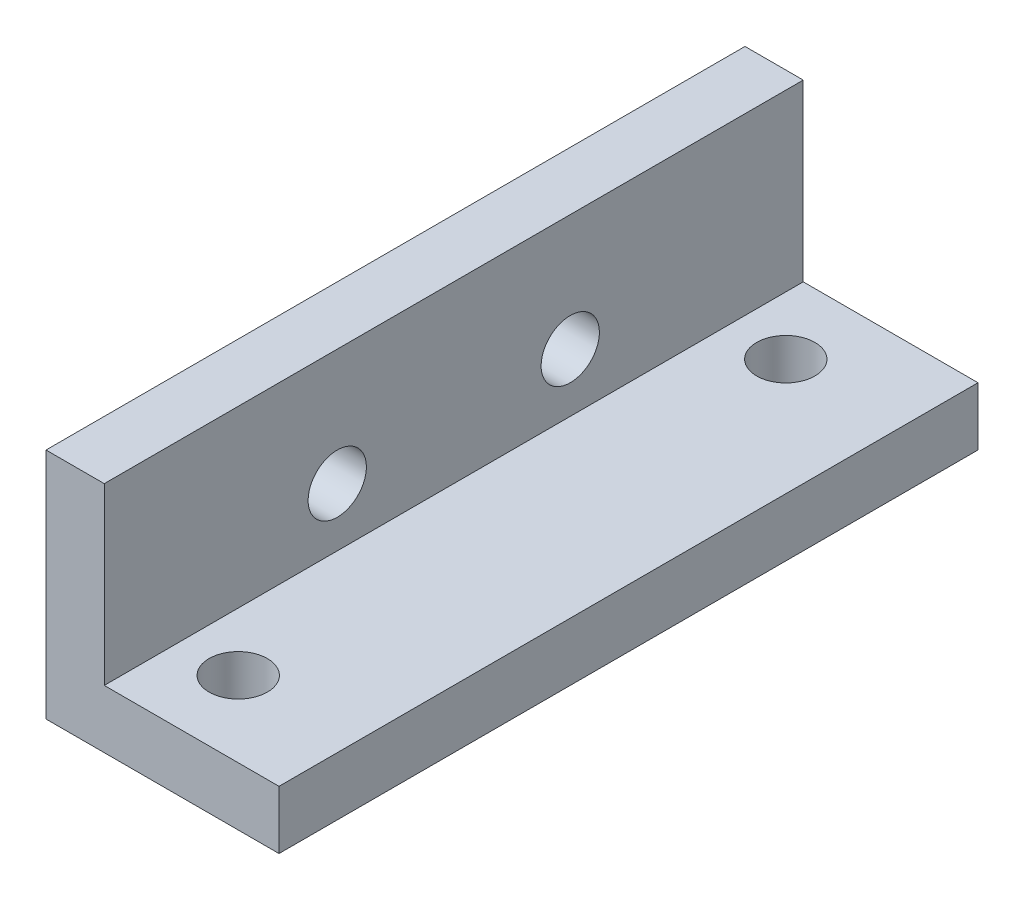
ISO-10303-21;
HEADER;
FILE_DESCRIPTION(('STEP AP214'),'2;1');
FILE_NAME('part.step','',(''),(''),'','','');
FILE_SCHEMA(('AUTOMOTIVE_DESIGN { 1 0 10303 214 1 1 1 1 }'));
ENDSEC;
DATA;
#1=APPLICATION_CONTEXT('core data for automotive mechanical design processes');
#2=APPLICATION_PROTOCOL_DEFINITION('international standard','automotive_design',2000,#1);
#3=PRODUCT_CONTEXT('',#1,'mechanical');
#4=PRODUCT('Part','Part','',(#3));
#5=PRODUCT_RELATED_PRODUCT_CATEGORY('part','',(#4));
#6=PRODUCT_DEFINITION_FORMATION('','',#4);
#7=PRODUCT_DEFINITION_CONTEXT('part definition',#1,'design');
#8=PRODUCT_DEFINITION('design','',#6,#7);
#9=PRODUCT_DEFINITION_SHAPE('','',#8);
#10=(LENGTH_UNIT() NAMED_UNIT(*) SI_UNIT(.MILLI.,.METRE.));
#11=(NAMED_UNIT(*) PLANE_ANGLE_UNIT() SI_UNIT($,.RADIAN.));
#12=(NAMED_UNIT(*) SI_UNIT($,.STERADIAN.) SOLID_ANGLE_UNIT());
#13=UNCERTAINTY_MEASURE_WITH_UNIT(LENGTH_MEASURE(1.E-05),#10,'distance_accuracy_value','');
#14=(GEOMETRIC_REPRESENTATION_CONTEXT(3) GLOBAL_UNCERTAINTY_ASSIGNED_CONTEXT((#13)) GLOBAL_UNIT_ASSIGNED_CONTEXT((#10,
#11,#12)) REPRESENTATION_CONTEXT('',''));
#15=CARTESIAN_POINT('',(0.,0.,0.));
#16=DIRECTION('',(0.,0.,1.));
#17=DIRECTION('',(1.,0.,0.));
#18=AXIS2_PLACEMENT_3D('',#15,#16,#17);
#19=CARTESIAN_POINT('',(0.,12.7,38.1));
#20=DIRECTION('',(0.,-1.,0.));
#21=DIRECTION('',(0.,0.,-1.));
#22=AXIS2_PLACEMENT_3D('',#19,#20,#21);
#23=PLANE('',#22);
#24=DIRECTION('',(-1.,0.,0.));
#25=VECTOR('',#24,1.);
#26=CARTESIAN_POINT('',(0.,12.7,0.));
#27=LINE('',#26,#25);
#28=CARTESIAN_POINT('',(3.175,12.7,0.));
#29=VERTEX_POINT('',#28);
#30=CARTESIAN_POINT('',(0.,12.7,0.));
#31=VERTEX_POINT('',#30);
#32=EDGE_CURVE('E117',#29,#31,#27,.T.);
#33=ORIENTED_EDGE('',*,*,#32,.T.);
#34=DIRECTION('',(0.,0.,-1.));
#35=VECTOR('',#34,1.);
#36=CARTESIAN_POINT('',(0.,12.7,38.1));
#37=LINE('',#36,#35);
#38=CARTESIAN_POINT('',(0.,12.7,38.1));
#39=VERTEX_POINT('',#38);
#40=EDGE_CURVE('E11',#39,#31,#37,.T.);
#41=ORIENTED_EDGE('',*,*,#40,.F.);
#42=DIRECTION('',(-1.,0.,0.));
#43=VECTOR('',#42,1.);
#44=CARTESIAN_POINT('',(0.,12.7,38.1));
#45=LINE('',#44,#43);
#46=CARTESIAN_POINT('',(3.175,12.7,38.1));
#47=VERTEX_POINT('',#46);
#48=EDGE_CURVE('E128',#47,#39,#45,.T.);
#49=ORIENTED_EDGE('',*,*,#48,.F.);
#50=DIRECTION('',(0.,0.,-1.));
#51=VECTOR('',#50,1.);
#52=CARTESIAN_POINT('',(3.175,12.7,38.1));
#53=LINE('',#52,#51);
#54=EDGE_CURVE('E113',#47,#29,#53,.T.);
#55=ORIENTED_EDGE('',*,*,#54,.T.);
#56=EDGE_LOOP('',(#33,#41,#49,#55));
#57=FACE_BOUND('',#56,.T.);
#58=ADVANCED_FACE('F31',(#57),#23,.F.);
#59=CARTESIAN_POINT('',(0.,12.7,38.1));
#60=DIRECTION('',(1.,0.,0.));
#61=DIRECTION('',(0.,1.,0.));
#62=AXIS2_PLACEMENT_3D('',#59,#60,#61);
#63=PLANE('',#62);
#64=CARTESIAN_POINT('',(0.,6.35,25.4));
#65=DIRECTION('',(-1.,0.,0.));
#66=DIRECTION('',(0.,1.,0.));
#67=AXIS2_PLACEMENT_3D('',#64,#65,#66);
#68=CIRCLE('',#67,1.5875);
#69=CARTESIAN_POINT('',(0.,7.9375,25.4));
#70=VERTEX_POINT('',#69);
#71=EDGE_CURVE('E139',#70,#70,#68,.T.);
#72=ORIENTED_EDGE('',*,*,#71,.F.);
#73=EDGE_LOOP('',(#72));
#74=FACE_BOUND('',#73,.T.);
#75=CARTESIAN_POINT('',(0.,6.35,12.7));
#76=DIRECTION('',(-1.,0.,0.));
#77=DIRECTION('',(0.,-1.,0.));
#78=AXIS2_PLACEMENT_3D('',#75,#76,#77);
#79=CIRCLE('',#78,1.5875);
#80=CARTESIAN_POINT('',(0.,4.7625,12.7));
#81=VERTEX_POINT('',#80);
#82=EDGE_CURVE('E136',#81,#81,#79,.T.);
#83=ORIENTED_EDGE('',*,*,#82,.F.);
#84=EDGE_LOOP('',(#83));
#85=FACE_BOUND('',#84,.T.);
#86=DIRECTION('',(0.,-1.,0.));
#87=VECTOR('',#86,1.);
#88=CARTESIAN_POINT('',(0.,12.7,0.));
#89=LINE('',#88,#87);
#90=CARTESIAN_POINT('',(0.,0.,0.));
#91=VERTEX_POINT('',#90);
#92=EDGE_CURVE('E120',#31,#91,#89,.T.);
#93=ORIENTED_EDGE('',*,*,#92,.T.);
#94=DIRECTION('',(0.,0.,-1.));
#95=VECTOR('',#94,1.);
#96=CARTESIAN_POINT('',(0.,0.,38.1));
#97=LINE('',#96,#95);
#98=CARTESIAN_POINT('',(0.,0.,38.1));
#99=VERTEX_POINT('',#98);
#100=EDGE_CURVE('E40',#99,#91,#97,.T.);
#101=ORIENTED_EDGE('',*,*,#100,.F.);
#102=DIRECTION('',(0.,-1.,0.));
#103=VECTOR('',#102,1.);
#104=CARTESIAN_POINT('',(0.,12.7,38.1));
#105=LINE('',#104,#103);
#106=EDGE_CURVE('E86',#39,#99,#105,.T.);
#107=ORIENTED_EDGE('',*,*,#106,.F.);
#108=ORIENTED_EDGE('',*,*,#40,.T.);
#109=EDGE_LOOP('',(#93,#101,#107,#108));
#110=FACE_BOUND('',#109,.T.);
#111=ADVANCED_FACE('F160',(#74,#85,#110),#63,.F.);
#112=CARTESIAN_POINT('',(0.,0.,38.1));
#113=DIRECTION('',(0.,1.,0.));
#114=DIRECTION('',(0.,0.,1.));
#115=AXIS2_PLACEMENT_3D('',#112,#113,#114);
#116=PLANE('',#115);
#117=CARTESIAN_POINT('',(6.35,0.,33.9725));
#118=DIRECTION('',(0.,-1.,0.));
#119=DIRECTION('',(0.,0.,1.));
#120=AXIS2_PLACEMENT_3D('',#117,#118,#119);
#121=CIRCLE('',#120,1.5875);
#122=CARTESIAN_POINT('',(6.35,0.,35.56));
#123=VERTEX_POINT('',#122);
#124=EDGE_CURVE('E152',#123,#123,#121,.T.);
#125=ORIENTED_EDGE('',*,*,#124,.F.);
#126=EDGE_LOOP('',(#125));
#127=FACE_BOUND('',#126,.T.);
#128=CARTESIAN_POINT('',(6.35,0.,4.1275));
#129=DIRECTION('',(0.,-1.,0.));
#130=DIRECTION('',(0.,0.,-1.));
#131=AXIS2_PLACEMENT_3D('',#128,#129,#130);
#132=CIRCLE('',#131,1.5875);
#133=CARTESIAN_POINT('',(6.35,0.,2.54));
#134=VERTEX_POINT('',#133);
#135=EDGE_CURVE('E142',#134,#134,#132,.T.);
#136=ORIENTED_EDGE('',*,*,#135,.F.);
#137=EDGE_LOOP('',(#136));
#138=FACE_BOUND('',#137,.T.);
#139=DIRECTION('',(1.,0.,0.));
#140=VECTOR('',#139,1.);
#141=CARTESIAN_POINT('',(0.,0.,0.));
#142=LINE('',#141,#140);
#143=CARTESIAN_POINT('',(12.7,0.,0.));
#144=VERTEX_POINT('',#143);
#145=EDGE_CURVE('E123',#91,#144,#142,.T.);
#146=ORIENTED_EDGE('',*,*,#145,.T.);
#147=DIRECTION('',(0.,0.,-1.));
#148=VECTOR('',#147,1.);
#149=CARTESIAN_POINT('',(12.7,0.,38.1));
#150=LINE('',#149,#148);
#151=CARTESIAN_POINT('',(12.7,0.,38.1));
#152=VERTEX_POINT('',#151);
#153=EDGE_CURVE('E108',#152,#144,#150,.T.);
#154=ORIENTED_EDGE('',*,*,#153,.F.);
#155=DIRECTION('',(1.,0.,0.));
#156=VECTOR('',#155,1.);
#157=CARTESIAN_POINT('',(0.,0.,38.1));
#158=LINE('',#157,#156);
#159=EDGE_CURVE('E99',#99,#152,#158,.T.);
#160=ORIENTED_EDGE('',*,*,#159,.F.);
#161=ORIENTED_EDGE('',*,*,#100,.T.);
#162=EDGE_LOOP('',(#146,#154,#160,#161));
#163=FACE_BOUND('',#162,.T.);
#164=ADVANCED_FACE('F163',(#127,#138,#163),#116,.F.);
#165=CARTESIAN_POINT('',(12.7,3.175,38.1));
#166=DIRECTION('',(-1.,0.,0.));
#167=DIRECTION('',(0.,0.,1.));
#168=AXIS2_PLACEMENT_3D('',#165,#166,#167);
#169=PLANE('',#168);
#170=DIRECTION('',(0.,1.,0.));
#171=VECTOR('',#170,1.);
#172=CARTESIAN_POINT('',(12.7,3.175,0.));
#173=LINE('',#172,#171);
#174=CARTESIAN_POINT('',(12.7,3.175,0.));
#175=VERTEX_POINT('',#174);
#176=EDGE_CURVE('E107',#144,#175,#173,.T.);
#177=ORIENTED_EDGE('',*,*,#176,.T.);
#178=DIRECTION('',(0.,0.,-1.));
#179=VECTOR('',#178,1.);
#180=CARTESIAN_POINT('',(12.7,3.175,38.1));
#181=LINE('',#180,#179);
#182=CARTESIAN_POINT('',(12.7,3.175,38.1));
#183=VERTEX_POINT('',#182);
#184=EDGE_CURVE('E104',#183,#175,#181,.T.);
#185=ORIENTED_EDGE('',*,*,#184,.F.);
#186=DIRECTION('',(0.,1.,0.));
#187=VECTOR('',#186,1.);
#188=CARTESIAN_POINT('',(12.7,3.175,38.1));
#189=LINE('',#188,#187);
#190=EDGE_CURVE('E93',#152,#183,#189,.T.);
#191=ORIENTED_EDGE('',*,*,#190,.F.);
#192=ORIENTED_EDGE('',*,*,#153,.T.);
#193=EDGE_LOOP('',(#177,#185,#191,#192));
#194=FACE_BOUND('',#193,.T.);
#195=ADVANCED_FACE('F105',(#194),#169,.F.);
#196=CARTESIAN_POINT('',(3.175,3.175,38.1));
#197=DIRECTION('',(0.,-1.,0.));
#198=DIRECTION('',(0.,0.,-1.));
#199=AXIS2_PLACEMENT_3D('',#196,#197,#198);
#200=PLANE('',#199);
#201=CARTESIAN_POINT('',(6.35,3.175,33.9725));
#202=DIRECTION('',(0.,-1.,0.));
#203=DIRECTION('',(0.,0.,-1.));
#204=AXIS2_PLACEMENT_3D('',#201,#202,#203);
#205=CIRCLE('',#204,1.5875);
#206=CARTESIAN_POINT('',(6.35,3.175,32.385));
#207=VERTEX_POINT('',#206);
#208=EDGE_CURVE('E34',#207,#207,#205,.T.);
#209=ORIENTED_EDGE('',*,*,#208,.T.);
#210=EDGE_LOOP('',(#209));
#211=FACE_BOUND('',#210,.T.);
#212=CARTESIAN_POINT('',(6.35,3.175,4.1275));
#213=DIRECTION('',(0.,-1.,0.));
#214=DIRECTION('',(0.,0.,-1.));
#215=AXIS2_PLACEMENT_3D('',#212,#213,#214);
#216=CIRCLE('',#215,1.5875);
#217=CARTESIAN_POINT('',(6.35,3.175,2.54));
#218=VERTEX_POINT('',#217);
#219=EDGE_CURVE('E140',#218,#218,#216,.T.);
#220=ORIENTED_EDGE('',*,*,#219,.T.);
#221=EDGE_LOOP('',(#220));
#222=FACE_BOUND('',#221,.T.);
#223=DIRECTION('',(-1.,0.,0.));
#224=VECTOR('',#223,1.);
#225=CARTESIAN_POINT('',(3.175,3.175,0.));
#226=LINE('',#225,#224);
#227=CARTESIAN_POINT('',(3.175,3.175,0.));
#228=VERTEX_POINT('',#227);
#229=EDGE_CURVE('E72',#175,#228,#226,.T.);
#230=ORIENTED_EDGE('',*,*,#229,.T.);
#231=DIRECTION('',(0.,0.,-1.));
#232=VECTOR('',#231,1.);
#233=CARTESIAN_POINT('',(3.175,3.175,38.1));
#234=LINE('',#233,#232);
#235=CARTESIAN_POINT('',(3.175,3.175,38.1));
#236=VERTEX_POINT('',#235);
#237=EDGE_CURVE('E109',#236,#228,#234,.T.);
#238=ORIENTED_EDGE('',*,*,#237,.F.);
#239=DIRECTION('',(-1.,0.,0.));
#240=VECTOR('',#239,1.);
#241=CARTESIAN_POINT('',(3.175,3.175,38.1));
#242=LINE('',#241,#240);
#243=EDGE_CURVE('E97',#183,#236,#242,.T.);
#244=ORIENTED_EDGE('',*,*,#243,.F.);
#245=ORIENTED_EDGE('',*,*,#184,.T.);
#246=EDGE_LOOP('',(#230,#238,#244,#245));
#247=FACE_BOUND('',#246,.T.);
#248=ADVANCED_FACE('F111',(#211,#222,#247),#200,.F.);
#249=CARTESIAN_POINT('',(3.175,12.7,38.1));
#250=DIRECTION('',(-1.,0.,0.));
#251=DIRECTION('',(0.,-1.,0.));
#252=AXIS2_PLACEMENT_3D('',#249,#250,#251);
#253=PLANE('',#252);
#254=CARTESIAN_POINT('',(3.175,6.35,25.4));
#255=DIRECTION('',(-1.,0.,0.));
#256=DIRECTION('',(0.,-1.,0.));
#257=AXIS2_PLACEMENT_3D('',#254,#255,#256);
#258=CIRCLE('',#257,1.5875);
#259=CARTESIAN_POINT('',(3.175,4.76250000000001,25.4));
#260=VERTEX_POINT('',#259);
#261=EDGE_CURVE('E137',#260,#260,#258,.T.);
#262=ORIENTED_EDGE('',*,*,#261,.T.);
#263=EDGE_LOOP('',(#262));
#264=FACE_BOUND('',#263,.T.);
#265=CARTESIAN_POINT('',(3.175,6.35,12.7));
#266=DIRECTION('',(-1.,0.,0.));
#267=DIRECTION('',(0.,-1.,0.));
#268=AXIS2_PLACEMENT_3D('',#265,#266,#267);
#269=CIRCLE('',#268,1.5875);
#270=CARTESIAN_POINT('',(3.175,4.7625,12.7));
#271=VERTEX_POINT('',#270);
#272=EDGE_CURVE('E121',#271,#271,#269,.T.);
#273=ORIENTED_EDGE('',*,*,#272,.T.);
#274=EDGE_LOOP('',(#273));
#275=FACE_BOUND('',#274,.T.);
#276=DIRECTION('',(0.,1.,0.));
#277=VECTOR('',#276,1.);
#278=CARTESIAN_POINT('',(3.175,12.7,0.));
#279=LINE('',#278,#277);
#280=EDGE_CURVE('E78',#228,#29,#279,.T.);
#281=ORIENTED_EDGE('',*,*,#280,.T.);
#282=ORIENTED_EDGE('',*,*,#54,.F.);
#283=DIRECTION('',(0.,1.,0.));
#284=VECTOR('',#283,1.);
#285=CARTESIAN_POINT('',(3.175,12.7,38.1));
#286=LINE('',#285,#284);
#287=EDGE_CURVE('E49',#236,#47,#286,.T.);
#288=ORIENTED_EDGE('',*,*,#287,.F.);
#289=ORIENTED_EDGE('',*,*,#237,.T.);
#290=EDGE_LOOP('',(#281,#282,#288,#289));
#291=FACE_BOUND('',#290,.T.);
#292=ADVANCED_FACE('F168',(#264,#275,#291),#253,.F.);
#293=CARTESIAN_POINT('',(3.175,12.7,38.1));
#294=DIRECTION('',(0.,0.,-1.));
#295=DIRECTION('',(-1.,0.,0.));
#296=AXIS2_PLACEMENT_3D('',#293,#294,#295);
#297=PLANE('',#296);
#298=ORIENTED_EDGE('',*,*,#48,.T.);
#299=ORIENTED_EDGE('',*,*,#106,.T.);
#300=ORIENTED_EDGE('',*,*,#159,.T.);
#301=ORIENTED_EDGE('',*,*,#190,.T.);
#302=ORIENTED_EDGE('',*,*,#243,.T.);
#303=ORIENTED_EDGE('',*,*,#287,.T.);
#304=EDGE_LOOP('',(#298,#299,#300,#301,#302,#303));
#305=FACE_BOUND('',#304,.T.);
#306=ADVANCED_FACE('F95',(#305),#297,.F.);
#307=CARTESIAN_POINT('',(3.175,12.7,0.));
#308=DIRECTION('',(0.,0.,-1.));
#309=DIRECTION('',(-1.,0.,0.));
#310=AXIS2_PLACEMENT_3D('',#307,#308,#309);
#311=PLANE('',#310);
#312=ORIENTED_EDGE('',*,*,#32,.F.);
#313=ORIENTED_EDGE('',*,*,#280,.F.);
#314=ORIENTED_EDGE('',*,*,#229,.F.);
#315=ORIENTED_EDGE('',*,*,#176,.F.);
#316=ORIENTED_EDGE('',*,*,#145,.F.);
#317=ORIENTED_EDGE('',*,*,#92,.F.);
#318=EDGE_LOOP('',(#312,#313,#314,#315,#316,#317));
#319=FACE_BOUND('',#318,.T.);
#320=ADVANCED_FACE('F166',(#319),#311,.T.);
#321=CARTESIAN_POINT('',(12.7,6.35,12.7));
#322=DIRECTION('',(-1.,0.,0.));
#323=DIRECTION('',(0.,-1.,0.));
#324=AXIS2_PLACEMENT_3D('',#321,#322,#323);
#325=CYLINDRICAL_SURFACE('',#324,1.5875);
#326=ORIENTED_EDGE('',*,*,#82,.T.);
#327=EDGE_LOOP('',(#326));
#328=FACE_BOUND('',#327,.T.);
#329=ORIENTED_EDGE('',*,*,#272,.F.);
#330=EDGE_LOOP('',(#329));
#331=FACE_BOUND('',#330,.T.);
#332=ADVANCED_FACE('F238',(#328,#331),#325,.F.);
#333=CARTESIAN_POINT('',(12.7,6.35,25.4));
#334=DIRECTION('',(-1.,0.,0.));
#335=DIRECTION('',(0.,-1.,0.));
#336=AXIS2_PLACEMENT_3D('',#333,#334,#335);
#337=CYLINDRICAL_SURFACE('',#336,1.5875);
#338=ORIENTED_EDGE('',*,*,#71,.T.);
#339=EDGE_LOOP('',(#338));
#340=FACE_BOUND('',#339,.T.);
#341=ORIENTED_EDGE('',*,*,#261,.F.);
#342=EDGE_LOOP('',(#341));
#343=FACE_BOUND('',#342,.T.);
#344=ADVANCED_FACE('F219',(#340,#343),#337,.F.);
#345=CARTESIAN_POINT('',(6.35,12.7,4.1275));
#346=DIRECTION('',(0.,-1.,0.));
#347=DIRECTION('',(0.,0.,-1.));
#348=AXIS2_PLACEMENT_3D('',#345,#346,#347);
#349=CYLINDRICAL_SURFACE('',#348,1.5875);
#350=ORIENTED_EDGE('',*,*,#135,.T.);
#351=EDGE_LOOP('',(#350));
#352=FACE_BOUND('',#351,.T.);
#353=ORIENTED_EDGE('',*,*,#219,.F.);
#354=EDGE_LOOP('',(#353));
#355=FACE_BOUND('',#354,.T.);
#356=ADVANCED_FACE('F213',(#352,#355),#349,.F.);
#357=CARTESIAN_POINT('',(6.35,12.7,33.9725));
#358=DIRECTION('',(0.,-1.,0.));
#359=DIRECTION('',(0.,0.,-1.));
#360=AXIS2_PLACEMENT_3D('',#357,#358,#359);
#361=CYLINDRICAL_SURFACE('',#360,1.5875);
#362=ORIENTED_EDGE('',*,*,#124,.T.);
#363=EDGE_LOOP('',(#362));
#364=FACE_BOUND('',#363,.T.);
#365=ORIENTED_EDGE('',*,*,#208,.F.);
#366=EDGE_LOOP('',(#365));
#367=FACE_BOUND('',#366,.T.);
#368=ADVANCED_FACE('F218',(#364,#367),#361,.F.);
#369=CLOSED_SHELL('',(#58,#111,#164,#195,#248,#292,#306,#320,#332,#344,#356,#368));
#370=MANIFOLD_SOLID_BREP('B2',#369);
#371=ADVANCED_BREP_SHAPE_REPRESENTATION('',(#18,#370),#14);
#372=SHAPE_DEFINITION_REPRESENTATION(#9,#371);
ENDSEC;
END-ISO-10303-21;
